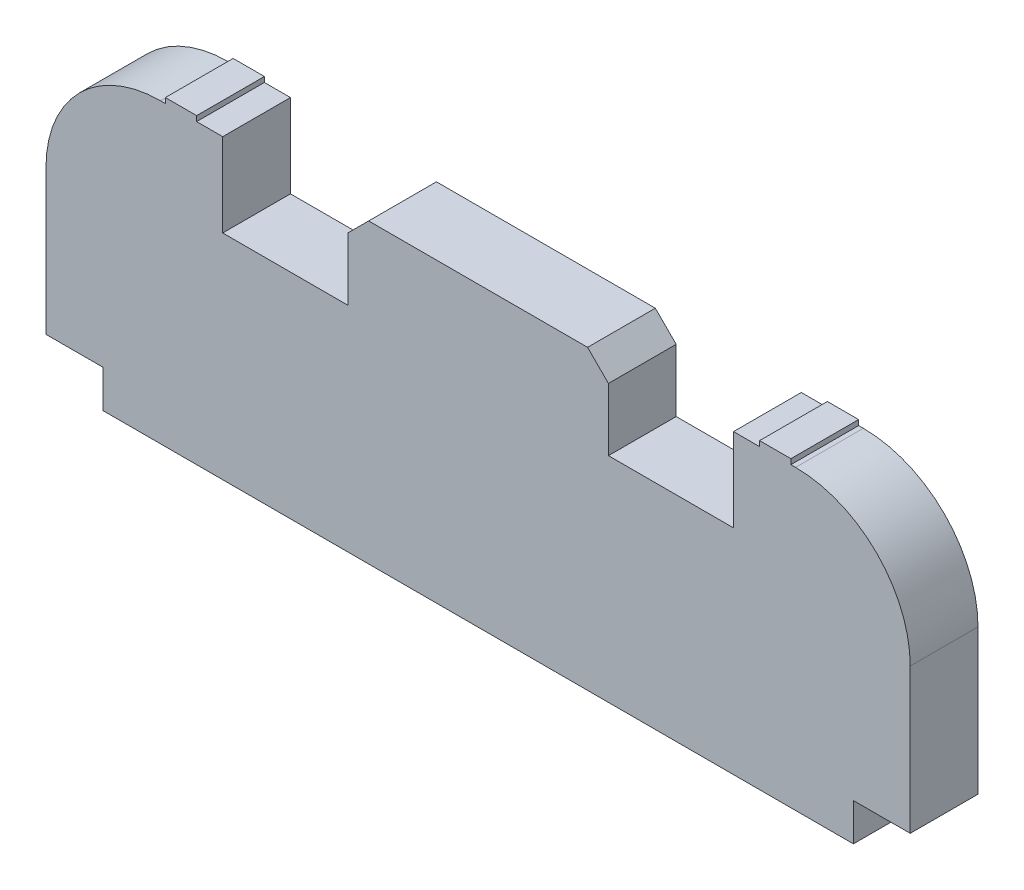
ISO-10303-21;
HEADER;
FILE_DESCRIPTION(('STEP AP214'),'2;1');
FILE_NAME('part.step','',(''),(''),'','','');
FILE_SCHEMA(('AUTOMOTIVE_DESIGN { 1 0 10303 214 1 1 1 1 }'));
ENDSEC;
DATA;
#1=APPLICATION_CONTEXT('core data for automotive mechanical design processes');
#2=APPLICATION_PROTOCOL_DEFINITION('international standard','automotive_design',2000,#1);
#3=PRODUCT_CONTEXT('',#1,'mechanical');
#4=PRODUCT('Part','Part','',(#3));
#5=PRODUCT_RELATED_PRODUCT_CATEGORY('part','',(#4));
#6=PRODUCT_DEFINITION_FORMATION('','',#4);
#7=PRODUCT_DEFINITION_CONTEXT('part definition',#1,'design');
#8=PRODUCT_DEFINITION('design','',#6,#7);
#9=PRODUCT_DEFINITION_SHAPE('','',#8);
#10=(LENGTH_UNIT() NAMED_UNIT(*) SI_UNIT(.MILLI.,.METRE.));
#11=(NAMED_UNIT(*) PLANE_ANGLE_UNIT() SI_UNIT($,.RADIAN.));
#12=(NAMED_UNIT(*) SI_UNIT($,.STERADIAN.) SOLID_ANGLE_UNIT());
#13=UNCERTAINTY_MEASURE_WITH_UNIT(LENGTH_MEASURE(1.E-05),#10,'distance_accuracy_value','');
#14=(GEOMETRIC_REPRESENTATION_CONTEXT(3) GLOBAL_UNCERTAINTY_ASSIGNED_CONTEXT((#13)) GLOBAL_UNIT_ASSIGNED_CONTEXT((#10,
#11,#12)) REPRESENTATION_CONTEXT('',''));
#15=CARTESIAN_POINT('',(0.,0.,0.));
#16=DIRECTION('',(0.,0.,1.));
#17=DIRECTION('',(1.,0.,0.));
#18=AXIS2_PLACEMENT_3D('',#15,#16,#17);
#19=CARTESIAN_POINT('',(-0.0001220203275138,1.393470990942,1.224951135067));
#20=DIRECTION('',(0.,1.,0.));
#21=DIRECTION('',(1.,0.,0.));
#22=AXIS2_PLACEMENT_3D('',#19,#20,#21);
#23=PLANE('',#22);
#24=DIRECTION('',(-3.182182204726E-13,-3.579954980316E-13,1.));
#25=VECTOR('',#24,1.);
#26=CARTESIAN_POINT('',(2.699877979672,1.393470990942,2.929574235257));
#27=LINE('',#26,#25);
#28=CARTESIAN_POINT('',(2.699877979672,1.393470990942,2.474951135068));
#29=VERTEX_POINT('',#28);
#30=CARTESIAN_POINT('',(2.699877979672,1.393470990942,3.124951135067));
#31=VERTEX_POINT('',#30);
#32=EDGE_CURVE('E345',#29,#31,#27,.T.);
#33=ORIENTED_EDGE('',*,*,#32,.T.);
#34=DIRECTION('',(1.,0.,0.));
#35=VECTOR('',#34,1.);
#36=CARTESIAN_POINT('',(2.699877979672,1.393470990942,3.124951135067));
#37=LINE('',#36,#35);
#38=CARTESIAN_POINT('',(2.999877979672,1.393470990942,3.124951135067));
#39=VERTEX_POINT('',#38);
#40=EDGE_CURVE('E440',#31,#39,#37,.T.);
#41=ORIENTED_EDGE('',*,*,#40,.T.);
#42=DIRECTION('',(0.,0.,-1.));
#43=VECTOR('',#42,1.);
#44=CARTESIAN_POINT('',(2.999877979672,1.393470990942,3.124951135067));
#45=LINE('',#44,#43);
#46=CARTESIAN_POINT('',(2.999877979672,1.393470990942,2.474951135068));
#47=VERTEX_POINT('',#46);
#48=EDGE_CURVE('E11',#39,#47,#45,.T.);
#49=ORIENTED_EDGE('',*,*,#48,.T.);
#50=DIRECTION('',(-1.,0.,0.));
#51=VECTOR('',#50,1.);
#52=CARTESIAN_POINT('',(1.349877979672,1.393470990942,2.474951135068));
#53=LINE('',#52,#51);
#54=EDGE_CURVE('E506',#47,#29,#53,.T.);
#55=ORIENTED_EDGE('',*,*,#54,.T.);
#56=EDGE_LOOP('',(#33,#41,#49,#55));
#57=FACE_BOUND('',#56,.T.);
#58=ADVANCED_FACE('F17',(#57),#23,.T.);
#59=CARTESIAN_POINT('',(2.999877979672,1.343470990942,3.774951135068));
#60=DIRECTION('',(1.,0.,0.));
#61=DIRECTION('',(0.,1.,0.));
#62=AXIS2_PLACEMENT_3D('',#59,#60,#61);
#63=PLANE('',#62);
#64=DIRECTION('',(0.,-1.,0.));
#65=VECTOR('',#64,1.);
#66=CARTESIAN_POINT('',(2.999877979672,0.643470990942,2.474951135068));
#67=LINE('',#66,#65);
#68=CARTESIAN_POINT('',(2.999877979672,1.343470990942,2.474951135068));
#69=VERTEX_POINT('',#68);
#70=EDGE_CURVE('E502',#47,#69,#67,.T.);
#71=ORIENTED_EDGE('',*,*,#70,.F.);
#72=ORIENTED_EDGE('',*,*,#48,.F.);
#73=DIRECTION('',(0.,1.,0.));
#74=VECTOR('',#73,1.);
#75=CARTESIAN_POINT('',(2.999877979672,1.343470990942,3.124951135068));
#76=LINE('',#75,#74);
#77=CARTESIAN_POINT('',(2.999877979672,1.343470990942,3.124951135068));
#78=VERTEX_POINT('',#77);
#79=EDGE_CURVE('E436',#78,#39,#76,.T.);
#80=ORIENTED_EDGE('',*,*,#79,.F.);
#81=DIRECTION('',(0.,0.,-1.));
#82=VECTOR('',#81,1.);
#83=CARTESIAN_POINT('',(2.999877979672,1.343470990942,3.124951135067));
#84=LINE('',#83,#82);
#85=EDGE_CURVE('E388',#78,#69,#84,.T.);
#86=ORIENTED_EDGE('',*,*,#85,.T.);
#87=EDGE_LOOP('',(#71,#72,#80,#86));
#88=FACE_BOUND('',#87,.T.);
#89=ADVANCED_FACE('F1114',(#88),#63,.T.);
#90=CARTESIAN_POINT('',(1.249877979672,1.343470990942,2.504951135068));
#91=DIRECTION('',(-1.,0.,0.));
#92=DIRECTION('',(0.,0.,1.));
#93=AXIS2_PLACEMENT_3D('',#90,#91,#92);
#94=PLANE('',#93);
#95=DIRECTION('',(0.,0.,-1.));
#96=VECTOR('',#95,1.);
#97=CARTESIAN_POINT('',(1.249877979672,1.143470990942,3.124951135068));
#98=LINE('',#97,#96);
#99=CARTESIAN_POINT('',(1.249877979672,1.143470990942,3.124951135068));
#100=VERTEX_POINT('',#99);
#101=CARTESIAN_POINT('',(1.249877979672,1.143470990942,2.474951135068));
#102=VERTEX_POINT('',#101);
#103=EDGE_CURVE('E322',#100,#102,#98,.T.);
#104=ORIENTED_EDGE('',*,*,#103,.F.);
#105=DIRECTION('',(0.,-1.,0.));
#106=VECTOR('',#105,1.);
#107=CARTESIAN_POINT('',(1.249877979672,1.143470990942,3.124951135068));
#108=LINE('',#107,#106);
#109=CARTESIAN_POINT('',(1.249877979672,0.543470990942,3.124951135068));
#110=VERTEX_POINT('',#109);
#111=EDGE_CURVE('E529',#100,#110,#108,.T.);
#112=ORIENTED_EDGE('',*,*,#111,.T.);
#113=DIRECTION('',(0.,0.,1.));
#114=VECTOR('',#113,1.);
#115=CARTESIAN_POINT('',(1.249877979672,0.543470990942,2.541871135068));
#116=LINE('',#115,#114);
#117=CARTESIAN_POINT('',(1.249877979672,0.543470990942,2.474951135068));
#118=VERTEX_POINT('',#117);
#119=EDGE_CURVE('E26',#118,#110,#116,.T.);
#120=ORIENTED_EDGE('',*,*,#119,.F.);
#121=DIRECTION('',(0.,1.,0.));
#122=VECTOR('',#121,1.);
#123=CARTESIAN_POINT('',(1.249877979672,0.543470990942,2.474951135068));
#124=LINE('',#123,#122);
#125=EDGE_CURVE('E377',#118,#102,#124,.T.);
#126=ORIENTED_EDGE('',*,*,#125,.T.);
#127=EDGE_LOOP('',(#104,#112,#120,#126));
#128=FACE_BOUND('',#127,.T.);
#129=ADVANCED_FACE('F1104',(#128),#94,.F.);
#130=CARTESIAN_POINT('',(-0.0001220203275138,0.543470990942,1.224951135067));
#131=DIRECTION('',(0.,1.,0.));
#132=DIRECTION('',(1.,0.,0.));
#133=AXIS2_PLACEMENT_3D('',#130,#131,#132);
#134=PLANE('',#133);
#135=ORIENTED_EDGE('',*,*,#119,.T.);
#136=DIRECTION('',(1.,0.,0.));
#137=VECTOR('',#136,1.);
#138=CARTESIAN_POINT('',(1.249877979672,0.543470990942,3.124951135067));
#139=LINE('',#138,#137);
#140=CARTESIAN_POINT('',(2.449877979672,0.543470990942,3.124951135067));
#141=VERTEX_POINT('',#140);
#142=EDGE_CURVE('E521',#110,#141,#139,.T.);
#143=ORIENTED_EDGE('',*,*,#142,.T.);
#144=DIRECTION('',(0.,0.,-1.));
#145=VECTOR('',#144,1.);
#146=CARTESIAN_POINT('',(2.449877979672,0.543470990942,3.124951135067));
#147=LINE('',#146,#145);
#148=CARTESIAN_POINT('',(2.449877979672,0.543470990942,2.474951135068));
#149=VERTEX_POINT('',#148);
#150=EDGE_CURVE('E47',#141,#149,#147,.T.);
#151=ORIENTED_EDGE('',*,*,#150,.T.);
#152=DIRECTION('',(-1.,0.,0.));
#153=VECTOR('',#152,1.);
#154=CARTESIAN_POINT('',(0.624877979672,0.543470990942,2.474951135068));
#155=LINE('',#154,#153);
#156=EDGE_CURVE('E373',#149,#118,#155,.T.);
#157=ORIENTED_EDGE('',*,*,#156,.T.);
#158=EDGE_LOOP('',(#135,#143,#151,#157));
#159=FACE_BOUND('',#158,.T.);
#160=ADVANCED_FACE('F1093',(#159),#134,.T.);
#161=CARTESIAN_POINT('',(2.449877979672,1.343470990942,3.124951135068));
#162=DIRECTION('',(1.,0.,0.));
#163=DIRECTION('',(0.,1.,0.));
#164=AXIS2_PLACEMENT_3D('',#161,#162,#163);
#165=PLANE('',#164);
#166=DIRECTION('',(0.,-1.,0.));
#167=VECTOR('',#166,1.);
#168=CARTESIAN_POINT('',(2.449877979672,0.243470990942,2.474951135068));
#169=LINE('',#168,#167);
#170=CARTESIAN_POINT('',(2.449877979672,1.343470990942,2.474951135068));
#171=VERTEX_POINT('',#170);
#172=EDGE_CURVE('E376',#171,#149,#169,.T.);
#173=ORIENTED_EDGE('',*,*,#172,.T.);
#174=ORIENTED_EDGE('',*,*,#150,.F.);
#175=DIRECTION('',(0.,-1.,0.));
#176=VECTOR('',#175,1.);
#177=CARTESIAN_POINT('',(2.449877979672,1.343470990942,3.124951135068));
#178=LINE('',#177,#176);
#179=CARTESIAN_POINT('',(2.449877979672,1.343470990942,3.124951135068));
#180=VERTEX_POINT('',#179);
#181=EDGE_CURVE('E517',#180,#141,#178,.T.);
#182=ORIENTED_EDGE('',*,*,#181,.F.);
#183=DIRECTION('',(0.,0.,-1.));
#184=VECTOR('',#183,1.);
#185=CARTESIAN_POINT('',(2.449877979672,1.343470990942,3.124951135067));
#186=LINE('',#185,#184);
#187=EDGE_CURVE('E338',#180,#171,#186,.T.);
#188=ORIENTED_EDGE('',*,*,#187,.T.);
#189=EDGE_LOOP('',(#173,#174,#182,#188));
#190=FACE_BOUND('',#189,.T.);
#191=ADVANCED_FACE('F1082',(#190),#165,.F.);
#192=CARTESIAN_POINT('',(-0.0001220203275138,0.543470990942,1.224951135067));
#193=DIRECTION('',(0.,1.,0.));
#194=DIRECTION('',(1.,0.,0.));
#195=AXIS2_PLACEMENT_3D('',#192,#193,#194);
#196=PLANE('',#195);
#197=DIRECTION('',(0.,0.,-1.));
#198=VECTOR('',#197,1.);
#199=CARTESIAN_POINT('',(-2.450122020328,0.543470990942,3.124951135068));
#200=LINE('',#199,#198);
#201=CARTESIAN_POINT('',(-2.450122020328,0.543470990942,3.124951135067));
#202=VERTEX_POINT('',#201);
#203=CARTESIAN_POINT('',(-2.450122020328,0.543470990942,2.474951135068));
#204=VERTEX_POINT('',#203);
#205=EDGE_CURVE('E320',#202,#204,#200,.T.);
#206=ORIENTED_EDGE('',*,*,#205,.F.);
#207=DIRECTION('',(1.,0.,0.));
#208=VECTOR('',#207,1.);
#209=CARTESIAN_POINT('',(-2.450122020328,0.543470990942,3.124951135067));
#210=LINE('',#209,#208);
#211=CARTESIAN_POINT('',(-1.250122020328,0.543470990942,3.124951135067));
#212=VERTEX_POINT('',#211);
#213=EDGE_CURVE('E383',#202,#212,#210,.T.);
#214=ORIENTED_EDGE('',*,*,#213,.T.);
#215=DIRECTION('',(0.,0.,-1.));
#216=VECTOR('',#215,1.);
#217=CARTESIAN_POINT('',(-1.250122020328,0.543470990942,3.124951135067));
#218=LINE('',#217,#216);
#219=CARTESIAN_POINT('',(-1.250122020328,0.543470990942,2.474951135068));
#220=VERTEX_POINT('',#219);
#221=EDGE_CURVE('E526',#212,#220,#218,.T.);
#222=ORIENTED_EDGE('',*,*,#221,.T.);
#223=DIRECTION('',(-1.,0.,0.));
#224=VECTOR('',#223,1.);
#225=CARTESIAN_POINT('',(-1.225122020328,0.543470990942,2.474951135068));
#226=LINE('',#225,#224);
#227=EDGE_CURVE('E415',#220,#204,#226,.T.);
#228=ORIENTED_EDGE('',*,*,#227,.T.);
#229=EDGE_LOOP('',(#206,#214,#222,#228));
#230=FACE_BOUND('',#229,.T.);
#231=ADVANCED_FACE('F1071',(#230),#196,.T.);
#232=CARTESIAN_POINT('',(-3.600122020328,-1.506529009058,3.124951135068));
#233=DIRECTION('',(1.,0.,0.));
#234=DIRECTION('',(0.,1.,0.));
#235=AXIS2_PLACEMENT_3D('',#232,#233,#234);
#236=PLANE('',#235);
#237=DIRECTION('',(0.,0.,1.));
#238=VECTOR('',#237,1.);
#239=CARTESIAN_POINT('',(-3.600122020328,-1.506529009058,2.474951135067));
#240=LINE('',#239,#238);
#241=CARTESIAN_POINT('',(-3.600122020328,-1.506529009058,2.474951135067));
#242=VERTEX_POINT('',#241);
#243=CARTESIAN_POINT('',(-3.600122020328,-1.506529009058,3.124951135068));
#244=VERTEX_POINT('',#243);
#245=EDGE_CURVE('E525',#242,#244,#240,.T.);
#246=ORIENTED_EDGE('',*,*,#245,.T.);
#247=DIRECTION('',(0.,-1.,0.));
#248=VECTOR('',#247,1.);
#249=CARTESIAN_POINT('',(-3.600122020328,-1.146529009058,3.124951135068));
#250=LINE('',#249,#248);
#251=CARTESIAN_POINT('',(-3.600122020328,-1.146529009058,3.124951135068));
#252=VERTEX_POINT('',#251);
#253=EDGE_CURVE('E551',#252,#244,#250,.T.);
#254=ORIENTED_EDGE('',*,*,#253,.F.);
#255=DIRECTION('',(0.,0.,-1.));
#256=VECTOR('',#255,1.);
#257=CARTESIAN_POINT('',(-3.600122020328,-1.146529009058,3.124951135067));
#258=LINE('',#257,#256);
#259=CARTESIAN_POINT('',(-3.600122020328,-1.146529009058,2.474951135067));
#260=VERTEX_POINT('',#259);
#261=EDGE_CURVE('E468',#252,#260,#258,.T.);
#262=ORIENTED_EDGE('',*,*,#261,.T.);
#263=DIRECTION('',(0.,1.,0.));
#264=VECTOR('',#263,1.);
#265=CARTESIAN_POINT('',(-3.600122020328,-1.506529009058,2.474951135067));
#266=LINE('',#265,#264);
#267=EDGE_CURVE('E356',#242,#260,#266,.T.);
#268=ORIENTED_EDGE('',*,*,#267,.F.);
#269=EDGE_LOOP('',(#246,#254,#262,#268));
#270=FACE_BOUND('',#269,.T.);
#271=ADVANCED_FACE('F1062',(#270),#236,.F.);
#272=CARTESIAN_POINT('',(3.599877979672,-1.146529009058,3.124951135068));
#273=DIRECTION('',(-1.,0.,0.));
#274=DIRECTION('',(0.,0.,1.));
#275=AXIS2_PLACEMENT_3D('',#272,#273,#274);
#276=PLANE('',#275);
#277=DIRECTION('',(0.,0.,1.));
#278=VECTOR('',#277,1.);
#279=CARTESIAN_POINT('',(3.599877979672,-1.146529009058,2.474951135067));
#280=LINE('',#279,#278);
#281=CARTESIAN_POINT('',(3.599877979672,-1.146529009058,2.474951135067));
#282=VERTEX_POINT('',#281);
#283=CARTESIAN_POINT('',(3.599877979672,-1.146529009058,3.124951135067));
#284=VERTEX_POINT('',#283);
#285=EDGE_CURVE('E499',#282,#284,#280,.T.);
#286=ORIENTED_EDGE('',*,*,#285,.T.);
#287=DIRECTION('',(0.,1.,0.));
#288=VECTOR('',#287,1.);
#289=CARTESIAN_POINT('',(3.599877979672,-1.506529009058,3.124951135068));
#290=LINE('',#289,#288);
#291=CARTESIAN_POINT('',(3.599877979672,-1.506529009058,3.124951135068));
#292=VERTEX_POINT('',#291);
#293=EDGE_CURVE('E447',#292,#284,#290,.T.);
#294=ORIENTED_EDGE('',*,*,#293,.F.);
#295=DIRECTION('',(0.,0.,1.));
#296=VECTOR('',#295,1.);
#297=CARTESIAN_POINT('',(3.599877979672,-1.506529009058,2.474951135067));
#298=LINE('',#297,#296);
#299=CARTESIAN_POINT('',(3.599877979672,-1.506529009058,2.474951135067));
#300=VERTEX_POINT('',#299);
#301=EDGE_CURVE('E574',#300,#292,#298,.T.);
#302=ORIENTED_EDGE('',*,*,#301,.F.);
#303=DIRECTION('',(0.,-1.,0.));
#304=VECTOR('',#303,1.);
#305=CARTESIAN_POINT('',(3.599877979672,-1.146529009058,2.474951135067));
#306=LINE('',#305,#304);
#307=EDGE_CURVE('E482',#282,#300,#306,.T.);
#308=ORIENTED_EDGE('',*,*,#307,.F.);
#309=EDGE_LOOP('',(#286,#294,#302,#308));
#310=FACE_BOUND('',#309,.T.);
#311=ADVANCED_FACE('F639',(#310),#276,.F.);
#312=CARTESIAN_POINT('',(-4.145122020328,-1.506529009058,3.124951135068));
#313=DIRECTION('',(0.,-1.,0.));
#314=DIRECTION('',(0.,0.,-1.));
#315=AXIS2_PLACEMENT_3D('',#312,#313,#314);
#316=PLANE('',#315);
#317=ORIENTED_EDGE('',*,*,#245,.F.);
#318=DIRECTION('',(1.,0.,0.));
#319=VECTOR('',#318,1.);
#320=CARTESIAN_POINT('',(-3.600122020328,-1.506529009058,2.474951135067));
#321=LINE('',#320,#319);
#322=EDGE_CURVE('E418',#242,#300,#321,.T.);
#323=ORIENTED_EDGE('',*,*,#322,.T.);
#324=ORIENTED_EDGE('',*,*,#301,.T.);
#325=DIRECTION('',(1.,4.618528244953E-13,0.));
#326=VECTOR('',#325,1.);
#327=CARTESIAN_POINT('',(-3.600122020328,-1.506529009058,3.124951135068));
#328=LINE('',#327,#326);
#329=EDGE_CURVE('E450',#244,#292,#328,.T.);
#330=ORIENTED_EDGE('',*,*,#329,.F.);
#331=EDGE_LOOP('',(#317,#323,#324,#330));
#332=FACE_BOUND('',#331,.T.);
#333=ADVANCED_FACE('F1041',(#332),#316,.T.);
#334=CARTESIAN_POINT('',(-2.700122020328,1.343470990942,3.774951135068));
#335=DIRECTION('',(1.,0.,0.));
#336=DIRECTION('',(0.,1.,0.));
#337=AXIS2_PLACEMENT_3D('',#334,#335,#336);
#338=PLANE('',#337);
#339=DIRECTION('',(0.,-1.,0.));
#340=VECTOR('',#339,1.);
#341=CARTESIAN_POINT('',(-2.700122020328,0.643470990942,2.474951135068));
#342=LINE('',#341,#340);
#343=CARTESIAN_POINT('',(-2.700122020328,1.393470990942,2.474951135068));
#344=VERTEX_POINT('',#343);
#345=CARTESIAN_POINT('',(-2.700122020328,1.343470990942,2.474951135068));
#346=VERTEX_POINT('',#345);
#347=EDGE_CURVE('E298',#344,#346,#342,.T.);
#348=ORIENTED_EDGE('',*,*,#347,.F.);
#349=DIRECTION('',(0.,0.,-1.));
#350=VECTOR('',#349,1.);
#351=CARTESIAN_POINT('',(-2.700122020328,1.393470990942,3.124951135067));
#352=LINE('',#351,#350);
#353=CARTESIAN_POINT('',(-2.700122020328,1.393470990942,3.124951135067));
#354=VERTEX_POINT('',#353);
#355=EDGE_CURVE('E522',#354,#344,#352,.T.);
#356=ORIENTED_EDGE('',*,*,#355,.F.);
#357=DIRECTION('',(0.,1.,0.));
#358=VECTOR('',#357,1.);
#359=CARTESIAN_POINT('',(-2.700122020328,1.343470990942,3.124951135068));
#360=LINE('',#359,#358);
#361=CARTESIAN_POINT('',(-2.700122020328,1.343470990942,3.124951135068));
#362=VERTEX_POINT('',#361);
#363=EDGE_CURVE('E378',#362,#354,#360,.T.);
#364=ORIENTED_EDGE('',*,*,#363,.F.);
#365=DIRECTION('',(0.,0.,-1.));
#366=VECTOR('',#365,1.);
#367=CARTESIAN_POINT('',(-2.700122020328,1.343470990942,3.124951135067));
#368=LINE('',#367,#366);
#369=EDGE_CURVE('E303',#362,#346,#368,.T.);
#370=ORIENTED_EDGE('',*,*,#369,.T.);
#371=EDGE_LOOP('',(#348,#356,#364,#370));
#372=FACE_BOUND('',#371,.T.);
#373=ADVANCED_FACE('F1030',(#372),#338,.T.);
#374=CARTESIAN_POINT('',(-0.0001220203275138,1.393470990942,1.224951135067));
#375=DIRECTION('',(0.,1.,0.));
#376=DIRECTION('',(1.,0.,0.));
#377=AXIS2_PLACEMENT_3D('',#374,#375,#376);
#378=PLANE('',#377);
#379=DIRECTION('',(0.,0.,1.));
#380=VECTOR('',#379,1.);
#381=CARTESIAN_POINT('',(-3.000122020328,1.393470990942,2.994951135067));
#382=LINE('',#381,#380);
#383=CARTESIAN_POINT('',(-3.000122020328,1.393470990942,2.474951135068));
#384=VERTEX_POINT('',#383);
#385=CARTESIAN_POINT('',(-3.000122020328,1.393470990942,3.124951135067));
#386=VERTEX_POINT('',#385);
#387=EDGE_CURVE('E357',#384,#386,#382,.T.);
#388=ORIENTED_EDGE('',*,*,#387,.T.);
#389=DIRECTION('',(1.,0.,0.));
#390=VECTOR('',#389,1.);
#391=CARTESIAN_POINT('',(-3.000122020328,1.393470990942,3.124951135067));
#392=LINE('',#391,#390);
#393=EDGE_CURVE('E382',#386,#354,#392,.T.);
#394=ORIENTED_EDGE('',*,*,#393,.T.);
#395=ORIENTED_EDGE('',*,*,#355,.T.);
#396=DIRECTION('',(-1.,0.,0.));
#397=VECTOR('',#396,1.);
#398=CARTESIAN_POINT('',(-1.500122020328,1.393470990942,2.474951135068));
#399=LINE('',#398,#397);
#400=EDGE_CURVE('E353',#344,#384,#399,.T.);
#401=ORIENTED_EDGE('',*,*,#400,.T.);
#402=EDGE_LOOP('',(#388,#394,#395,#401));
#403=FACE_BOUND('',#402,.T.);
#404=ADVANCED_FACE('F1019',(#403),#378,.T.);
#405=CARTESIAN_POINT('',(-1.250122020328,1.343470990942,3.124951135068));
#406=DIRECTION('',(1.,0.,0.));
#407=DIRECTION('',(0.,1.,0.));
#408=AXIS2_PLACEMENT_3D('',#405,#406,#407);
#409=PLANE('',#408);
#410=ORIENTED_EDGE('',*,*,#221,.F.);
#411=DIRECTION('',(0.,-1.,0.));
#412=VECTOR('',#411,1.);
#413=CARTESIAN_POINT('',(-1.250122020328,1.143470990942,3.124951135068));
#414=LINE('',#413,#412);
#415=CARTESIAN_POINT('',(-1.250122020328,1.143470990942,3.124951135068));
#416=VERTEX_POINT('',#415);
#417=EDGE_CURVE('E467',#416,#212,#414,.T.);
#418=ORIENTED_EDGE('',*,*,#417,.F.);
#419=DIRECTION('',(0.,5.160009463392E-13,1.));
#420=VECTOR('',#419,1.);
#421=CARTESIAN_POINT('',(-1.250122020328,1.143470990942,2.489371135067));
#422=LINE('',#421,#420);
#423=CARTESIAN_POINT('',(-1.250122020328,1.143470990942,2.474951135068));
#424=VERTEX_POINT('',#423);
#425=EDGE_CURVE('E567',#424,#416,#422,.T.);
#426=ORIENTED_EDGE('',*,*,#425,.F.);
#427=DIRECTION('',(0.,-1.,0.));
#428=VECTOR('',#427,1.);
#429=CARTESIAN_POINT('',(-1.250122020328,0.243470990942,2.474951135068));
#430=LINE('',#429,#428);
#431=EDGE_CURVE('E410',#424,#220,#430,.T.);
#432=ORIENTED_EDGE('',*,*,#431,.T.);
#433=EDGE_LOOP('',(#410,#418,#426,#432));
#434=FACE_BOUND('',#433,.T.);
#435=ADVANCED_FACE('F1008',(#434),#409,.F.);
#436=CARTESIAN_POINT('',(-1.150122020328,1.243470990942,2.814951135068));
#437=DIRECTION('',(-0.707106781186548,0.707106781186548,0.));
#438=DIRECTION('',(0.,0.,1.));
#439=AXIS2_PLACEMENT_3D('',#436,#437,#438);
#440=PLANE('',#439);
#441=DIRECTION('',(0.707106781186548,0.707106781186548,0.));
#442=VECTOR('',#441,1.);
#443=CARTESIAN_POINT('',(-1.187622020328,1.205970990942,2.474951135068));
#444=LINE('',#443,#442);
#445=CARTESIAN_POINT('',(-1.050122020328,1.343470990942,2.474951135068));
#446=VERTEX_POINT('',#445);
#447=EDGE_CURVE('E414',#424,#446,#444,.T.);
#448=ORIENTED_EDGE('',*,*,#447,.F.);
#449=ORIENTED_EDGE('',*,*,#425,.T.);
#450=DIRECTION('',(-0.707106781186548,-0.707106781186548,0.));
#451=VECTOR('',#450,1.);
#452=CARTESIAN_POINT('',(-1.050122020328,1.343470990942,3.124951135068));
#453=LINE('',#452,#451);
#454=CARTESIAN_POINT('',(-1.050122020328,1.343470990942,3.124951135067));
#455=VERTEX_POINT('',#454);
#456=EDGE_CURVE('E537',#455,#416,#453,.T.);
#457=ORIENTED_EDGE('',*,*,#456,.F.);
#458=DIRECTION('',(0.,0.,-1.));
#459=VECTOR('',#458,1.);
#460=CARTESIAN_POINT('',(-1.050122020328,1.343470990942,3.124951135067));
#461=LINE('',#460,#459);
#462=EDGE_CURVE('E505',#455,#446,#461,.T.);
#463=ORIENTED_EDGE('',*,*,#462,.T.);
#464=EDGE_LOOP('',(#448,#449,#457,#463));
#465=FACE_BOUND('',#464,.T.);
#466=ADVANCED_FACE('F998',(#465),#440,.T.);
#467=CARTESIAN_POINT('',(4.144877979672,1.343470990942,1.224951135067));
#468=DIRECTION('',(0.,1.,0.));
#469=DIRECTION('',(1.,0.,0.));
#470=AXIS2_PLACEMENT_3D('',#467,#468,#469);
#471=PLANE('',#470);
#472=DIRECTION('',(1.,0.,0.));
#473=VECTOR('',#472,1.);
#474=CARTESIAN_POINT('',(2.072377979672,1.343470990942,2.474951135068));
#475=LINE('',#474,#473);
#476=CARTESIAN_POINT('',(1.049877979672,1.343470990942,2.474951135068));
#477=VERTEX_POINT('',#476);
#478=EDGE_CURVE('E547',#446,#477,#475,.T.);
#479=ORIENTED_EDGE('',*,*,#478,.F.);
#480=ORIENTED_EDGE('',*,*,#462,.F.);
#481=DIRECTION('',(-1.,0.,0.));
#482=VECTOR('',#481,1.);
#483=CARTESIAN_POINT('',(1.049877979672,1.343470990942,3.124951135067));
#484=LINE('',#483,#482);
#485=CARTESIAN_POINT('',(1.049877979672,1.343470990942,3.124951135068));
#486=VERTEX_POINT('',#485);
#487=EDGE_CURVE('E533',#486,#455,#484,.T.);
#488=ORIENTED_EDGE('',*,*,#487,.F.);
#489=DIRECTION('',(2.549249461335E-13,0.,1.));
#490=VECTOR('',#489,1.);
#491=CARTESIAN_POINT('',(1.049877979672,1.343470990942,2.321871135067));
#492=LINE('',#491,#490);
#493=EDGE_CURVE('E1188',#477,#486,#492,.T.);
#494=ORIENTED_EDGE('',*,*,#493,.F.);
#495=EDGE_LOOP('',(#479,#480,#488,#494));
#496=FACE_BOUND('',#495,.T.);
#497=ADVANCED_FACE('F989',(#496),#471,.T.);
#498=CARTESIAN_POINT('',(-1.150122020328,-1.146529009058,2.474951135068));
#499=DIRECTION('',(0.,0.,-1.));
#500=DIRECTION('',(0.,-1.,0.));
#501=AXIS2_PLACEMENT_3D('',#498,#499,#500);
#502=PLANE('',#501);
#503=ORIENTED_EDGE('',*,*,#307,.T.);
#504=ORIENTED_EDGE('',*,*,#322,.F.);
#505=ORIENTED_EDGE('',*,*,#267,.T.);
#506=DIRECTION('',(-1.,0.,0.));
#507=VECTOR('',#506,1.);
#508=CARTESIAN_POINT('',(-2.072622020328,-1.146529009058,2.474951135068));
#509=LINE('',#508,#507);
#510=CARTESIAN_POINT('',(-4.145122020328,-1.146529009058,2.474951135068));
#511=VERTEX_POINT('',#510);
#512=EDGE_CURVE('E473',#260,#511,#509,.T.);
#513=ORIENTED_EDGE('',*,*,#512,.T.);
#514=DIRECTION('',(0.,1.,0.));
#515=VECTOR('',#514,1.);
#516=CARTESIAN_POINT('',(-4.145122020328,0.643470990942,2.474951135068));
#517=LINE('',#516,#515);
#518=CARTESIAN_POINT('',(-4.145122020328,0.243470990942,2.474951135068));
#519=VERTEX_POINT('',#518);
#520=EDGE_CURVE('E423',#511,#519,#517,.T.);
#521=ORIENTED_EDGE('',*,*,#520,.T.);
#522=CARTESIAN_POINT('',(-3.045122020328,0.243470990942,2.474951135068));
#523=DIRECTION('',(0.,0.,-1.));
#524=DIRECTION('',(-1.,0.,0.));
#525=AXIS2_PLACEMENT_3D('',#522,#523,#524);
#526=CIRCLE('',#525,1.1);
#527=CARTESIAN_POINT('',(-3.04512202013,1.343470990942,2.474951135068));
#528=VERTEX_POINT('',#527);
#529=EDGE_CURVE('E405',#519,#528,#526,.T.);
#530=ORIENTED_EDGE('',*,*,#529,.T.);
#531=DIRECTION('',(1.,0.,0.));
#532=VECTOR('',#531,1.);
#533=CARTESIAN_POINT('',(2.072377979672,1.343470990942,2.474951135068));
#534=LINE('',#533,#532);
#535=CARTESIAN_POINT('',(-3.000122020328,1.343470990942,2.474951135068));
#536=VERTEX_POINT('',#535);
#537=EDGE_CURVE('E432',#528,#536,#534,.T.);
#538=ORIENTED_EDGE('',*,*,#537,.T.);
#539=DIRECTION('',(0.,1.,0.));
#540=VECTOR('',#539,1.);
#541=CARTESIAN_POINT('',(-3.000122020328,0.643470990942,2.474951135068));
#542=LINE('',#541,#540);
#543=EDGE_CURVE('E340',#536,#384,#542,.T.);
#544=ORIENTED_EDGE('',*,*,#543,.T.);
#545=ORIENTED_EDGE('',*,*,#400,.F.);
#546=ORIENTED_EDGE('',*,*,#347,.T.);
#547=DIRECTION('',(1.,0.,0.));
#548=VECTOR('',#547,1.);
#549=CARTESIAN_POINT('',(2.072377979672,1.343470990942,2.474951135068));
#550=LINE('',#549,#548);
#551=CARTESIAN_POINT('',(-2.450122020328,1.343470990942,2.474951135068));
#552=VERTEX_POINT('',#551);
#553=EDGE_CURVE('E289',#346,#552,#550,.T.);
#554=ORIENTED_EDGE('',*,*,#553,.T.);
#555=DIRECTION('',(0.,-1.,0.));
#556=VECTOR('',#555,1.);
#557=CARTESIAN_POINT('',(-2.450122020328,0.643470990942,2.474951135068));
#558=LINE('',#557,#556);
#559=EDGE_CURVE('E295',#552,#204,#558,.T.);
#560=ORIENTED_EDGE('',*,*,#559,.T.);
#561=ORIENTED_EDGE('',*,*,#227,.F.);
#562=ORIENTED_EDGE('',*,*,#431,.F.);
#563=ORIENTED_EDGE('',*,*,#447,.T.);
#564=ORIENTED_EDGE('',*,*,#478,.T.);
#565=DIRECTION('',(0.707106781186548,-0.707106781186548,0.));
#566=VECTOR('',#565,1.);
#567=CARTESIAN_POINT('',(1.187377979672,1.205970990942,2.474951135068));
#568=LINE('',#567,#566);
#569=EDGE_CURVE('E1194',#477,#102,#568,.T.);
#570=ORIENTED_EDGE('',*,*,#569,.T.);
#571=ORIENTED_EDGE('',*,*,#125,.F.);
#572=ORIENTED_EDGE('',*,*,#156,.F.);
#573=ORIENTED_EDGE('',*,*,#172,.F.);
#574=DIRECTION('',(1.,0.,0.));
#575=VECTOR('',#574,1.);
#576=CARTESIAN_POINT('',(2.072377979672,1.343470990942,2.474951135068));
#577=LINE('',#576,#575);
#578=CARTESIAN_POINT('',(2.699877979672,1.343470990942,2.474951135068));
#579=VERTEX_POINT('',#578);
#580=EDGE_CURVE('E456',#171,#579,#577,.T.);
#581=ORIENTED_EDGE('',*,*,#580,.T.);
#582=DIRECTION('',(0.,1.,0.));
#583=VECTOR('',#582,1.);
#584=CARTESIAN_POINT('',(2.699877979672,0.643470990942,2.474951135068));
#585=LINE('',#584,#583);
#586=EDGE_CURVE('E348',#579,#29,#585,.T.);
#587=ORIENTED_EDGE('',*,*,#586,.T.);
#588=ORIENTED_EDGE('',*,*,#54,.F.);
#589=ORIENTED_EDGE('',*,*,#70,.T.);
#590=DIRECTION('',(1.,0.,0.));
#591=VECTOR('',#590,1.);
#592=CARTESIAN_POINT('',(2.072377979672,1.343470990942,2.474951135068));
#593=LINE('',#592,#591);
#594=CARTESIAN_POINT('',(3.044877979561,1.343470990942,2.474951135068));
#595=VERTEX_POINT('',#594);
#596=EDGE_CURVE('E384',#69,#595,#593,.T.);
#597=ORIENTED_EDGE('',*,*,#596,.T.);
#598=CARTESIAN_POINT('',(3.044877979672,0.243470990942,2.474951135068));
#599=DIRECTION('',(0.,0.,-1.));
#600=DIRECTION('',(0.,1.,0.));
#601=AXIS2_PLACEMENT_3D('',#598,#599,#600);
#602=CIRCLE('',#601,1.1);
#603=CARTESIAN_POINT('',(4.144877979672,0.243470990942,2.474951135068));
#604=VERTEX_POINT('',#603);
#605=EDGE_CURVE('E474',#595,#604,#602,.T.);
#606=ORIENTED_EDGE('',*,*,#605,.T.);
#607=DIRECTION('',(0.,-1.,0.));
#608=VECTOR('',#607,1.);
#609=CARTESIAN_POINT('',(4.144877979672,-0.601529009058,2.474951135068));
#610=LINE('',#609,#608);
#611=CARTESIAN_POINT('',(4.144877979672,-1.146529009058,2.474951135068));
#612=VERTEX_POINT('',#611);
#613=EDGE_CURVE('E485',#604,#612,#610,.T.);
#614=ORIENTED_EDGE('',*,*,#613,.T.);
#615=DIRECTION('',(-1.,0.,0.));
#616=VECTOR('',#615,1.);
#617=CARTESIAN_POINT('',(-2.072622020328,-1.146529009058,2.474951135068));
#618=LINE('',#617,#616);
#619=EDGE_CURVE('E486',#612,#282,#618,.T.);
#620=ORIENTED_EDGE('',*,*,#619,.T.);
#621=EDGE_LOOP('',(#503,#504,#505,#513,#521,#530,#538,#544,#545,#546,#554,#560,#561,#562,#563,
#564,#570,#571,#572,#573,#581,#587,#588,#589,#597,#606,#614,#620));
#622=FACE_BOUND('',#621,.T.);
#623=ADVANCED_FACE('F292',(#622),#502,.T.);
#624=CARTESIAN_POINT('',(4.144877979672,-1.146529009058,1.224951135067));
#625=DIRECTION('',(1.,0.,0.));
#626=DIRECTION('',(0.,1.,0.));
#627=AXIS2_PLACEMENT_3D('',#624,#625,#626);
#628=PLANE('',#627);
#629=ORIENTED_EDGE('',*,*,#613,.F.);
#630=DIRECTION('',(1.66143670508E-08,-1.014126604117E-10,-1.));
#631=VECTOR('',#630,1.);
#632=CARTESIAN_POINT('',(4.144877979672,0.243470990192,3.064951135818));
#633=LINE('',#632,#631);
#634=CARTESIAN_POINT('',(4.144877979672,0.243470990192,3.064951135818));
#635=VERTEX_POINT('',#634);
#636=EDGE_CURVE('E337',#635,#604,#633,.T.);
#637=ORIENTED_EDGE('',*,*,#636,.F.);
#638=CARTESIAN_POINT('',(4.14483253083819,0.233471722529685,3.074951126536));
#639=CARTESIAN_POINT('',(4.14483631821475,0.233888347206002,3.07453446025608));
#640=CARTESIAN_POINT('',(4.14483986888661,0.23430497403411,3.07411779397617));
#641=CARTESIAN_POINT('',(4.14484649681681,0.235138231455971,3.07328446141633));
#642=CARTESIAN_POINT('',(4.14484957407515,0.235554862049724,3.07286779513642));
#643=CARTESIAN_POINT('',(4.14485525517422,0.236388126464937,3.07203446257658));
#644=CARTESIAN_POINT('',(4.14485785901494,0.236804760286396,3.07161779629667));
#645=CARTESIAN_POINT('',(4.14486259327545,0.237638030619076,3.07078446373683));
#646=CARTESIAN_POINT('',(4.14486472369523,0.238054667130296,3.07036779745692));
#647=CARTESIAN_POINT('',(4.14486851111109,0.238887942304549,3.06953446489708));
#648=CARTESIAN_POINT('',(4.14487016810717,0.239304580967583,3.06911779861717));
#649=CARTESIAN_POINT('',(4.14487300867348,0.240137859907512,3.06828446605733));
#650=CARTESIAN_POINT('',(4.14487419224373,0.240554500184407,3.06786779977742));
#651=CARTESIAN_POINT('',(4.14487608595681,0.241387781814108,3.06703446721758));
#652=CARTESIAN_POINT('',(4.14487679609966,0.241804423166913,3.06661780093767));
#653=CARTESIAN_POINT('',(4.14487774295717,0.242637706410479,3.06578446837783));
#654=CARTESIAN_POINT('',(4.14487797967183,0.243054348301239,3.06536780209792));
#655=CARTESIAN_POINT('',(4.144877979672,0.243470990192,3.064951135818));
#656=B_SPLINE_CURVE_WITH_KNOTS('',3,(#638,#639,#640,#641,#642,#643,#644,#645,#646,#647,#648,
#649,#650,#651,#652,#653,#654,#655),.UNSPECIFIED.,.F.,.F.,(4,2,2,2,2,2,2,2,4),(0.,
0.00176771352812203,0.00353542705624406,0.00530314058436486,0.00707085411248689,
0.00883856764060891,0.0106062811687297,0.0123739946968517,0.0141417082249738),.UNSPECIFIED.);
#657=CARTESIAN_POINT('',(4.144855255217,0.233471519485,3.074951130069));
#658=VERTEX_POINT('',#657);
#659=EDGE_CURVE('E491',#658,#635,#656,.T.);
#660=ORIENTED_EDGE('',*,*,#659,.F.);
#661=CARTESIAN_POINT('',(3.044877979672,0.243470990942,3.074951135067));
#662=DIRECTION('',(0.,0.,-1.));
#663=DIRECTION('',(1.,0.,0.));
#664=AXIS2_PLACEMENT_3D('',#661,#662,#663);
#665=CIRCLE('',#664,1.1);
#666=CARTESIAN_POINT('',(4.144877979672,0.243470990942,3.074951135067));
#667=VERTEX_POINT('',#666);
#668=EDGE_CURVE('E621',#667,#658,#665,.T.);
#669=ORIENTED_EDGE('',*,*,#668,.F.);
#670=DIRECTION('',(0.,0.,-1.));
#671=VECTOR('',#670,1.);
#672=CARTESIAN_POINT('',(4.144877979672,0.243470990942,3.124951135067));
#673=LINE('',#672,#671);
#674=CARTESIAN_POINT('',(4.144877979672,0.243470990942,3.124951135067));
#675=VERTEX_POINT('',#674);
#676=EDGE_CURVE('E481',#675,#667,#673,.T.);
#677=ORIENTED_EDGE('',*,*,#676,.F.);
#678=DIRECTION('',(0.,-1.,0.));
#679=VECTOR('',#678,1.);
#680=CARTESIAN_POINT('',(4.144877979672,0.243470990942,3.124951135067));
#681=LINE('',#680,#679);
#682=CARTESIAN_POINT('',(4.144877979672,-1.146529009058,3.124951135067));
#683=VERTEX_POINT('',#682);
#684=EDGE_CURVE('E441',#675,#683,#681,.T.);
#685=ORIENTED_EDGE('',*,*,#684,.T.);
#686=DIRECTION('',(0.,0.,-1.));
#687=VECTOR('',#686,1.);
#688=CARTESIAN_POINT('',(4.144877979672,-1.146529009058,3.124951135067));
#689=LINE('',#688,#687);
#690=EDGE_CURVE('E490',#683,#612,#689,.T.);
#691=ORIENTED_EDGE('',*,*,#690,.T.);
#692=EDGE_LOOP('',(#629,#637,#660,#669,#677,#685,#691));
#693=FACE_BOUND('',#692,.T.);
#694=ADVANCED_FACE('F628',(#693),#628,.T.);
#695=CARTESIAN_POINT('',(-0.0001220203275138,0.698470990942,3.124951135068));
#696=DIRECTION('',(0.,0.,1.));
#697=DIRECTION('',(1.,0.,0.));
#698=AXIS2_PLACEMENT_3D('',#695,#696,#697);
#699=PLANE('',#698);
#700=ORIENTED_EDGE('',*,*,#329,.T.);
#701=ORIENTED_EDGE('',*,*,#293,.T.);
#702=DIRECTION('',(1.,0.,0.));
#703=VECTOR('',#702,1.);
#704=CARTESIAN_POINT('',(3.599877979672,-1.146529009058,3.124951135067));
#705=LINE('',#704,#703);
#706=EDGE_CURVE('E495',#284,#683,#705,.T.);
#707=ORIENTED_EDGE('',*,*,#706,.T.);
#708=ORIENTED_EDGE('',*,*,#684,.F.);
#709=CARTESIAN_POINT('',(3.044877979672,0.243470990942,3.124951135067));
#710=DIRECTION('',(0.,0.,1.));
#711=DIRECTION('',(1.,0.,0.));
#712=AXIS2_PLACEMENT_3D('',#709,#710,#711);
#713=CIRCLE('',#712,1.1);
#714=CARTESIAN_POINT('',(3.044877979561,1.343470990942,3.124951135067));
#715=VERTEX_POINT('',#714);
#716=EDGE_CURVE('E478',#675,#715,#713,.T.);
#717=ORIENTED_EDGE('',*,*,#716,.T.);
#718=DIRECTION('',(-1.,1.485231694413E-12,0.));
#719=VECTOR('',#718,1.);
#720=CARTESIAN_POINT('',(3.044877979561,1.343470990942,3.124951135067));
#721=LINE('',#720,#719);
#722=EDGE_CURVE('E422',#715,#78,#721,.T.);
#723=ORIENTED_EDGE('',*,*,#722,.T.);
#724=ORIENTED_EDGE('',*,*,#79,.T.);
#725=ORIENTED_EDGE('',*,*,#40,.F.);
#726=DIRECTION('',(0.,1.,0.));
#727=VECTOR('',#726,1.);
#728=CARTESIAN_POINT('',(2.699877979672,1.343470990942,3.124951135067));
#729=LINE('',#728,#727);
#730=CARTESIAN_POINT('',(2.699877979672,1.343470990942,3.124951135067));
#731=VERTEX_POINT('',#730);
#732=EDGE_CURVE('E366',#731,#31,#729,.T.);
#733=ORIENTED_EDGE('',*,*,#732,.F.);
#734=DIRECTION('',(-1.,0.,0.));
#735=VECTOR('',#734,1.);
#736=CARTESIAN_POINT('',(2.699877979672,1.343470990942,3.124951135067));
#737=LINE('',#736,#735);
#738=EDGE_CURVE('E334',#731,#180,#737,.T.);
#739=ORIENTED_EDGE('',*,*,#738,.T.);
#740=ORIENTED_EDGE('',*,*,#181,.T.);
#741=ORIENTED_EDGE('',*,*,#142,.F.);
#742=ORIENTED_EDGE('',*,*,#111,.F.);
#743=DIRECTION('',(-0.707106781186548,0.707106781186548,0.));
#744=VECTOR('',#743,1.);
#745=CARTESIAN_POINT('',(1.249877979672,1.143470990942,3.124951135068));
#746=LINE('',#745,#744);
#747=EDGE_CURVE('E329',#100,#486,#746,.T.);
#748=ORIENTED_EDGE('',*,*,#747,.T.);
#749=ORIENTED_EDGE('',*,*,#487,.T.);
#750=ORIENTED_EDGE('',*,*,#456,.T.);
#751=ORIENTED_EDGE('',*,*,#417,.T.);
#752=ORIENTED_EDGE('',*,*,#213,.F.);
#753=DIRECTION('',(0.,-1.,0.));
#754=VECTOR('',#753,1.);
#755=CARTESIAN_POINT('',(-2.450122020328,1.343470990942,3.124951135068));
#756=LINE('',#755,#754);
#757=CARTESIAN_POINT('',(-2.450122020328,1.343470990942,3.124951135068));
#758=VERTEX_POINT('',#757);
#759=EDGE_CURVE('E315',#758,#202,#756,.T.);
#760=ORIENTED_EDGE('',*,*,#759,.F.);
#761=DIRECTION('',(-1.,0.,0.));
#762=VECTOR('',#761,1.);
#763=CARTESIAN_POINT('',(-2.450122020328,1.343470990942,3.124951135067));
#764=LINE('',#763,#762);
#765=EDGE_CURVE('E310',#758,#362,#764,.T.);
#766=ORIENTED_EDGE('',*,*,#765,.T.);
#767=ORIENTED_EDGE('',*,*,#363,.T.);
#768=ORIENTED_EDGE('',*,*,#393,.F.);
#769=DIRECTION('',(0.,1.,0.));
#770=VECTOR('',#769,1.);
#771=CARTESIAN_POINT('',(-3.000122020328,1.343470990942,3.124951135067));
#772=LINE('',#771,#770);
#773=CARTESIAN_POINT('',(-3.000122020328,1.343470990942,3.124951135067));
#774=VERTEX_POINT('',#773);
#775=EDGE_CURVE('E362',#774,#386,#772,.T.);
#776=ORIENTED_EDGE('',*,*,#775,.F.);
#777=DIRECTION('',(-1.,-1.485231697231E-12,0.));
#778=VECTOR('',#777,1.);
#779=CARTESIAN_POINT('',(-3.000122020328,1.343470990942,3.124951135067));
#780=LINE('',#779,#778);
#781=CARTESIAN_POINT('',(-3.04512202013,1.343470990942,3.124951135067));
#782=VERTEX_POINT('',#781);
#783=EDGE_CURVE('E389',#774,#782,#780,.T.);
#784=ORIENTED_EDGE('',*,*,#783,.T.);
#785=CARTESIAN_POINT('',(-3.045122020328,0.243470990942,3.124951135067));
#786=DIRECTION('',(0.,0.,1.));
#787=DIRECTION('',(1.84095163356E-12,1.,0.));
#788=AXIS2_PLACEMENT_3D('',#785,#786,#787);
#789=CIRCLE('',#788,1.1);
#790=CARTESIAN_POINT('',(-4.145122020328,0.243470990942,3.124951135067));
#791=VERTEX_POINT('',#790);
#792=EDGE_CURVE('E396',#782,#791,#789,.T.);
#793=ORIENTED_EDGE('',*,*,#792,.T.);
#794=DIRECTION('',(0.,1.,0.));
#795=VECTOR('',#794,1.);
#796=CARTESIAN_POINT('',(-4.145122020328,-1.146529009058,3.124951135067));
#797=LINE('',#796,#795);
#798=CARTESIAN_POINT('',(-4.145122020328,-1.146529009058,3.124951135067));
#799=VERTEX_POINT('',#798);
#800=EDGE_CURVE('E429',#799,#791,#797,.T.);
#801=ORIENTED_EDGE('',*,*,#800,.F.);
#802=DIRECTION('',(1.,0.,0.));
#803=VECTOR('',#802,1.);
#804=CARTESIAN_POINT('',(-4.145122020328,-1.146529009058,3.124951135067));
#805=LINE('',#804,#803);
#806=EDGE_CURVE('E472',#799,#252,#805,.T.);
#807=ORIENTED_EDGE('',*,*,#806,.T.);
#808=ORIENTED_EDGE('',*,*,#253,.T.);
#809=EDGE_LOOP('',(#700,#701,#707,#708,#717,#723,#724,#725,#733,#739,#740,#741,#742,#748,#749,
#750,#751,#752,#760,#766,#767,#768,#776,#784,#793,#801,#807,#808));
#810=FACE_BOUND('',#809,.T.);
#811=ADVANCED_FACE('F604',(#810),#699,.T.);
#812=CARTESIAN_POINT('',(-4.145122020328,-1.146529009058,1.224951135067));
#813=DIRECTION('',(0.,-1.,0.));
#814=DIRECTION('',(0.,0.,-1.));
#815=AXIS2_PLACEMENT_3D('',#812,#813,#814);
#816=PLANE('',#815);
#817=ORIENTED_EDGE('',*,*,#512,.F.);
#818=ORIENTED_EDGE('',*,*,#261,.F.);
#819=ORIENTED_EDGE('',*,*,#806,.F.);
#820=DIRECTION('',(0.,0.,-1.));
#821=VECTOR('',#820,1.);
#822=CARTESIAN_POINT('',(-4.145122020328,-1.146529009058,3.124951135067));
#823=LINE('',#822,#821);
#824=EDGE_CURVE('E426',#799,#511,#823,.T.);
#825=ORIENTED_EDGE('',*,*,#824,.T.);
#826=EDGE_LOOP('',(#817,#818,#819,#825));
#827=FACE_BOUND('',#826,.T.);
#828=ADVANCED_FACE('F957',(#827),#816,.T.);
#829=CARTESIAN_POINT('',(-4.145122020328,-1.146529009058,1.224951135067));
#830=DIRECTION('',(0.,-1.,0.));
#831=DIRECTION('',(0.,0.,-1.));
#832=AXIS2_PLACEMENT_3D('',#829,#830,#831);
#833=PLANE('',#832);
#834=ORIENTED_EDGE('',*,*,#619,.F.);
#835=ORIENTED_EDGE('',*,*,#690,.F.);
#836=ORIENTED_EDGE('',*,*,#706,.F.);
#837=ORIENTED_EDGE('',*,*,#285,.F.);
#838=EDGE_LOOP('',(#834,#835,#836,#837));
#839=FACE_BOUND('',#838,.T.);
#840=ADVANCED_FACE('F602',(#839),#833,.T.);
#841=CARTESIAN_POINT('',(3.044877979672,0.243470990942,11.40281113507));
#842=DIRECTION('',(0.,0.,-1.));
#843=DIRECTION('',(0.,1.,0.));
#844=AXIS2_PLACEMENT_3D('',#841,#842,#843);
#845=CYLINDRICAL_SURFACE('',#844,1.1);
#846=ORIENTED_EDGE('',*,*,#636,.T.);
#847=ORIENTED_EDGE('',*,*,#605,.F.);
#848=DIRECTION('',(7.069560509857E-11,-1.602801630411E-08,1.));
#849=VECTOR('',#848,1.);
#850=CARTESIAN_POINT('',(3.04487797944,1.34347101819,1.424951107817));
#851=LINE('',#850,#849);
#852=EDGE_CURVE('E304',#595,#715,#851,.T.);
#853=ORIENTED_EDGE('',*,*,#852,.T.);
#854=ORIENTED_EDGE('',*,*,#716,.F.);
#855=ORIENTED_EDGE('',*,*,#676,.T.);
#856=ORIENTED_EDGE('',*,*,#668,.T.);
#857=ORIENTED_EDGE('',*,*,#659,.T.);
#858=EDGE_LOOP('',(#846,#847,#853,#854,#855,#856,#857));
#859=FACE_BOUND('',#858,.T.);
#860=ADVANCED_FACE('F591',(#859),#845,.T.);
#861=CARTESIAN_POINT('',(4.144877979672,1.343470990942,1.224951135067));
#862=DIRECTION('',(0.,1.,0.));
#863=DIRECTION('',(1.,0.,0.));
#864=AXIS2_PLACEMENT_3D('',#861,#862,#863);
#865=PLANE('',#864);
#866=ORIENTED_EDGE('',*,*,#580,.F.);
#867=ORIENTED_EDGE('',*,*,#187,.F.);
#868=ORIENTED_EDGE('',*,*,#738,.F.);
#869=DIRECTION('',(0.,0.,-1.));
#870=VECTOR('',#869,1.);
#871=CARTESIAN_POINT('',(2.699877979672,1.343470990942,3.124951135067));
#872=LINE('',#871,#870);
#873=EDGE_CURVE('E352',#731,#579,#872,.T.);
#874=ORIENTED_EDGE('',*,*,#873,.T.);
#875=EDGE_LOOP('',(#866,#867,#868,#874));
#876=FACE_BOUND('',#875,.T.);
#877=ADVANCED_FACE('F601',(#876),#865,.T.);
#878=CARTESIAN_POINT('',(4.144877979672,1.343470990942,1.224951135067));
#879=DIRECTION('',(0.,1.,0.));
#880=DIRECTION('',(1.,0.,0.));
#881=AXIS2_PLACEMENT_3D('',#878,#879,#880);
#882=PLANE('',#881);
#883=ORIENTED_EDGE('',*,*,#553,.F.);
#884=ORIENTED_EDGE('',*,*,#369,.F.);
#885=ORIENTED_EDGE('',*,*,#765,.F.);
#886=DIRECTION('',(0.,0.,1.));
#887=VECTOR('',#886,1.);
#888=CARTESIAN_POINT('',(-2.450122020328,1.343470990942,2.321871135067));
#889=LINE('',#888,#887);
#890=EDGE_CURVE('E307',#552,#758,#889,.T.);
#891=ORIENTED_EDGE('',*,*,#890,.F.);
#892=EDGE_LOOP('',(#883,#884,#885,#891));
#893=FACE_BOUND('',#892,.T.);
#894=ADVANCED_FACE('F308',(#893),#882,.T.);
#895=CARTESIAN_POINT('',(4.144877979672,1.343470990942,1.224951135067));
#896=DIRECTION('',(0.,1.,0.));
#897=DIRECTION('',(1.,0.,0.));
#898=AXIS2_PLACEMENT_3D('',#895,#896,#897);
#899=PLANE('',#898);
#900=ORIENTED_EDGE('',*,*,#596,.F.);
#901=ORIENTED_EDGE('',*,*,#85,.F.);
#902=ORIENTED_EDGE('',*,*,#722,.F.);
#903=ORIENTED_EDGE('',*,*,#852,.F.);
#904=EDGE_LOOP('',(#900,#901,#902,#903));
#905=FACE_BOUND('',#904,.T.);
#906=ADVANCED_FACE('F661',(#905),#899,.T.);
#907=CARTESIAN_POINT('',(4.144877979672,1.343470990942,1.224951135067));
#908=DIRECTION('',(0.,1.,0.));
#909=DIRECTION('',(1.,0.,0.));
#910=AXIS2_PLACEMENT_3D('',#907,#908,#909);
#911=PLANE('',#910);
#912=ORIENTED_EDGE('',*,*,#537,.F.);
#913=DIRECTION('',(7.234030252235E-11,1.602811060776E-08,-1.));
#914=VECTOR('',#913,1.);
#915=CARTESIAN_POINT('',(-3.04512202013,1.343470990942,3.124951135067));
#916=LINE('',#915,#914);
#917=EDGE_CURVE('E400',#782,#528,#916,.T.);
#918=ORIENTED_EDGE('',*,*,#917,.F.);
#919=ORIENTED_EDGE('',*,*,#783,.F.);
#920=DIRECTION('',(0.,0.,-1.));
#921=VECTOR('',#920,1.);
#922=CARTESIAN_POINT('',(-3.000122020328,1.343470990942,3.124951135067));
#923=LINE('',#922,#921);
#924=EDGE_CURVE('E344',#774,#536,#923,.T.);
#925=ORIENTED_EDGE('',*,*,#924,.T.);
#926=EDGE_LOOP('',(#912,#918,#919,#925));
#927=FACE_BOUND('',#926,.T.);
#928=ADVANCED_FACE('F903',(#927),#911,.T.);
#929=CARTESIAN_POINT('',(-4.145122020328,1.343470990942,1.224951135067));
#930=DIRECTION('',(-1.,0.,0.));
#931=DIRECTION('',(0.,0.,1.));
#932=AXIS2_PLACEMENT_3D('',#929,#930,#931);
#933=PLANE('',#932);
#934=ORIENTED_EDGE('',*,*,#520,.F.);
#935=ORIENTED_EDGE('',*,*,#824,.F.);
#936=ORIENTED_EDGE('',*,*,#800,.T.);
#937=DIRECTION('',(0.,0.,1.));
#938=VECTOR('',#937,1.);
#939=CARTESIAN_POINT('',(-4.145122020328,0.243470990942,3.074951135067));
#940=LINE('',#939,#938);
#941=CARTESIAN_POINT('',(-4.145122020328,0.243470990942,3.074951135067));
#942=VERTEX_POINT('',#941);
#943=EDGE_CURVE('E401',#942,#791,#940,.T.);
#944=ORIENTED_EDGE('',*,*,#943,.F.);
#945=CARTESIAN_POINT('',(-3.045122020328,0.243470990942,3.074951130069));
#946=DIRECTION('',(0.,0.,-1.));
#947=DIRECTION('',(-0.999958682907567,-0.00909024079790024,0.));
#948=AXIS2_PLACEMENT_3D('',#945,#946,#947);
#949=CIRCLE('',#948,1.1);
#950=CARTESIAN_POINT('',(-4.145099295872,0.233471519486,3.074951130069));
#951=VERTEX_POINT('',#950);
#952=EDGE_CURVE('E1255',#951,#942,#949,.T.);
#953=ORIENTED_EDGE('',*,*,#952,.F.);
#954=CARTESIAN_POINT('',(-4.145122020328,0.243470990942005,3.064951135441));
#955=CARTESIAN_POINT('',(-4.14512202032811,0.243054349020034,3.06536780173658));
#956=CARTESIAN_POINT('',(-4.1451217836137,0.242637707098065,3.06578446803216));
#957=CARTESIAN_POINT('',(-4.14512083675662,0.241804423792081,3.06661780062333));
#958=CARTESIAN_POINT('',(-4.14512012661395,0.241387782408067,3.06703446691892));
#959=CARTESIAN_POINT('',(-4.14511823290115,0.240554500715947,3.06786779951008));
#960=CARTESIAN_POINT('',(-4.14511704933101,0.240137860407841,3.06828446580566));
#961=CARTESIAN_POINT('',(-4.14511420876484,0.239304581405493,3.06911779839683));
#962=CARTESIAN_POINT('',(-4.1451125517688,0.238887942711251,3.06953446469242));
#963=CARTESIAN_POINT('',(-4.14510876435294,0.238054667474578,3.07036779728358));
#964=CARTESIAN_POINT('',(-4.14510663393312,0.237638030932149,3.07078446357917));
#965=CARTESIAN_POINT('',(-4.14510189967247,0.236804760537051,3.07161779617033));
#966=CARTESIAN_POINT('',(-4.14509929583164,0.236388126684383,3.07203446246592));
#967=CARTESIAN_POINT('',(-4.14509361473229,0.235554862206753,3.07286779505708));
#968=CARTESIAN_POINT('',(-4.14509053747377,0.23513823158179,3.07328446135266));
#969=CARTESIAN_POINT('',(-4.14508390954315,0.234304974097512,3.07411779394383));
#970=CARTESIAN_POINT('',(-4.14508035887105,0.233888347238195,3.07453446023941));
#971=CARTESIAN_POINT('',(-4.1450765714942,0.233471722530672,3.074951126535));
#972=B_SPLINE_CURVE_WITH_KNOTS('',3,(#954,#955,#956,#957,#958,#959,#960,#961,#962,#963,#964,
#965,#966,#967,#968,#969,#970,#971),.UNSPECIFIED.,.F.,.F.,(4,2,2,2,2,2,2,2,4),(0.,
0.00176771362755873,0.0035354272551187,0.00530314088267744,0.0070708545102374,
0.00883856813779614,0.0106062817653549,0.0123739953929136,0.0141417090204736),.UNSPECIFIED.);
#973=CARTESIAN_POINT('',(-4.145122020328,0.2434709907,3.064951135441));
#974=VERTEX_POINT('',#973);
#975=EDGE_CURVE('E361',#974,#951,#972,.T.);
#976=ORIENTED_EDGE('',*,*,#975,.F.);
#977=DIRECTION('',(1.661436705463E-08,1.428720600127E-10,1.));
#978=VECTOR('',#977,1.);
#979=CARTESIAN_POINT('',(-4.145122047575,0.243470990465,1.424951107816));
#980=LINE('',#979,#978);
#981=EDGE_CURVE('E409',#519,#974,#980,.T.);
#982=ORIENTED_EDGE('',*,*,#981,.F.);
#983=EDGE_LOOP('',(#934,#935,#936,#944,#953,#976,#982));
#984=FACE_BOUND('',#983,.T.);
#985=ADVANCED_FACE('F892',(#984),#933,.T.);
#986=CARTESIAN_POINT('',(-3.045122020328,0.243470990942,11.40281113507));
#987=DIRECTION('',(0.,0.,-1.));
#988=DIRECTION('',(-1.,0.,0.));
#989=AXIS2_PLACEMENT_3D('',#986,#987,#988);
#990=CYLINDRICAL_SURFACE('',#989,1.1);
#991=ORIENTED_EDGE('',*,*,#975,.T.);
#992=ORIENTED_EDGE('',*,*,#952,.T.);
#993=ORIENTED_EDGE('',*,*,#943,.T.);
#994=ORIENTED_EDGE('',*,*,#792,.F.);
#995=ORIENTED_EDGE('',*,*,#917,.T.);
#996=ORIENTED_EDGE('',*,*,#529,.F.);
#997=ORIENTED_EDGE('',*,*,#981,.T.);
#998=EDGE_LOOP('',(#991,#992,#993,#994,#995,#996,#997));
#999=FACE_BOUND('',#998,.T.);
#1000=ADVANCED_FACE('F880',(#999),#990,.T.);
#1001=CARTESIAN_POINT('',(-3.000122020328,1.343470990942,2.574951135067));
#1002=DIRECTION('',(-1.,0.,0.));
#1003=DIRECTION('',(0.,0.,1.));
#1004=AXIS2_PLACEMENT_3D('',#1001,#1002,#1003);
#1005=PLANE('',#1004);
#1006=ORIENTED_EDGE('',*,*,#543,.F.);
#1007=ORIENTED_EDGE('',*,*,#924,.F.);
#1008=ORIENTED_EDGE('',*,*,#775,.T.);
#1009=ORIENTED_EDGE('',*,*,#387,.F.);
#1010=EDGE_LOOP('',(#1006,#1007,#1008,#1009));
#1011=FACE_BOUND('',#1010,.T.);
#1012=ADVANCED_FACE('F867',(#1011),#1005,.T.);
#1013=CARTESIAN_POINT('',(2.699877979672,1.343470990942,2.574951135067));
#1014=DIRECTION('',(-1.,0.,0.));
#1015=DIRECTION('',(0.,0.,1.));
#1016=AXIS2_PLACEMENT_3D('',#1013,#1014,#1015);
#1017=PLANE('',#1016);
#1018=ORIENTED_EDGE('',*,*,#586,.F.);
#1019=ORIENTED_EDGE('',*,*,#873,.F.);
#1020=ORIENTED_EDGE('',*,*,#732,.T.);
#1021=ORIENTED_EDGE('',*,*,#32,.F.);
#1022=EDGE_LOOP('',(#1018,#1019,#1020,#1021));
#1023=FACE_BOUND('',#1022,.T.);
#1024=ADVANCED_FACE('F857',(#1023),#1017,.T.);
#1025=CARTESIAN_POINT('',(-2.450122020328,1.343470990942,2.504951135068));
#1026=DIRECTION('',(-1.,0.,0.));
#1027=DIRECTION('',(0.,0.,1.));
#1028=AXIS2_PLACEMENT_3D('',#1025,#1026,#1027);
#1029=PLANE('',#1028);
#1030=ORIENTED_EDGE('',*,*,#559,.F.);
#1031=ORIENTED_EDGE('',*,*,#890,.T.);
#1032=ORIENTED_EDGE('',*,*,#759,.T.);
#1033=ORIENTED_EDGE('',*,*,#205,.T.);
#1034=EDGE_LOOP('',(#1030,#1031,#1032,#1033));
#1035=FACE_BOUND('',#1034,.T.);
#1036=ADVANCED_FACE('F318',(#1035),#1029,.F.);
#1037=CARTESIAN_POINT('',(1.149877979672,1.243470990942,2.814951135068));
#1038=DIRECTION('',(0.707106781186548,0.707106781186548,0.));
#1039=DIRECTION('',(0.,0.,-1.));
#1040=AXIS2_PLACEMENT_3D('',#1037,#1038,#1039);
#1041=PLANE('',#1040);
#1042=ORIENTED_EDGE('',*,*,#569,.F.);
#1043=ORIENTED_EDGE('',*,*,#493,.T.);
#1044=ORIENTED_EDGE('',*,*,#747,.F.);
#1045=ORIENTED_EDGE('',*,*,#103,.T.);
#1046=EDGE_LOOP('',(#1042,#1043,#1044,#1045));
#1047=FACE_BOUND('',#1046,.T.);
#1048=ADVANCED_FACE('F841',(#1047),#1041,.T.);
#1049=CLOSED_SHELL('',(#58,#89,#129,#160,#191,#231,#271,#311,#333,#373,#404,#435,#466,#497,#623,
#694,#811,#828,#840,#860,#877,#894,#906,#928,#985,#1000,#1012,#1024,#1036,#1048));
#1050=MANIFOLD_SOLID_BREP('B1',#1049);
#1051=ADVANCED_BREP_SHAPE_REPRESENTATION('',(#18,#1050),#14);
#1052=SHAPE_DEFINITION_REPRESENTATION(#9,#1051);
ENDSEC;
END-ISO-10303-21;
